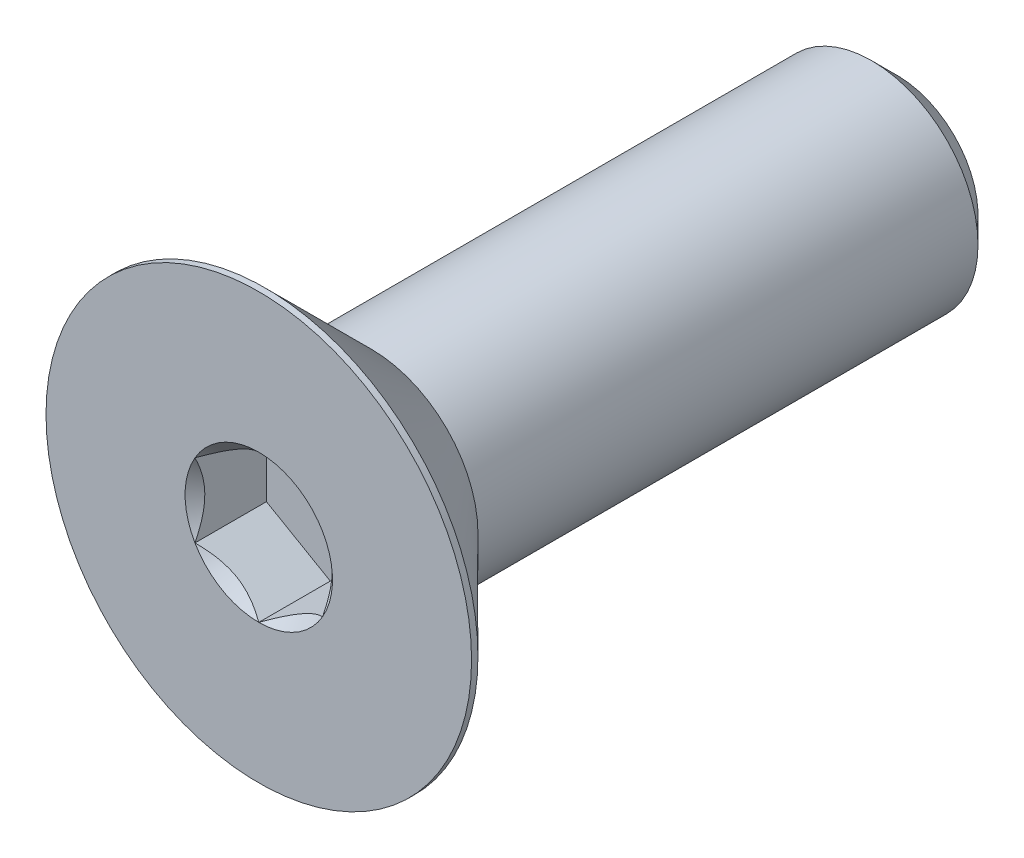
ISO-10303-21;
HEADER;
FILE_DESCRIPTION(('STEP AP214'),'2;1');
FILE_NAME('part.step','',(''),(''),'','','');
FILE_SCHEMA(('AUTOMOTIVE_DESIGN { 1 0 10303 214 1 1 1 1 }'));
ENDSEC;
DATA;
#1=APPLICATION_CONTEXT('core data for automotive mechanical design processes');
#2=APPLICATION_PROTOCOL_DEFINITION('international standard','automotive_design',2000,#1);
#3=PRODUCT_CONTEXT('',#1,'mechanical');
#4=PRODUCT('Part','Part','',(#3));
#5=PRODUCT_RELATED_PRODUCT_CATEGORY('part','',(#4));
#6=PRODUCT_DEFINITION_FORMATION('','',#4);
#7=PRODUCT_DEFINITION_CONTEXT('part definition',#1,'design');
#8=PRODUCT_DEFINITION('design','',#6,#7);
#9=PRODUCT_DEFINITION_SHAPE('','',#8);
#10=(LENGTH_UNIT() NAMED_UNIT(*) SI_UNIT(.MILLI.,.METRE.));
#11=(NAMED_UNIT(*) PLANE_ANGLE_UNIT() SI_UNIT($,.RADIAN.));
#12=(NAMED_UNIT(*) SI_UNIT($,.STERADIAN.) SOLID_ANGLE_UNIT());
#13=UNCERTAINTY_MEASURE_WITH_UNIT(LENGTH_MEASURE(1.E-05),#10,'distance_accuracy_value','');
#14=(GEOMETRIC_REPRESENTATION_CONTEXT(3) GLOBAL_UNCERTAINTY_ASSIGNED_CONTEXT((#13)) GLOBAL_UNIT_ASSIGNED_CONTEXT((#10,
#11,#12)) REPRESENTATION_CONTEXT('',''));
#15=CARTESIAN_POINT('',(0.,0.,0.));
#16=DIRECTION('',(0.,0.,1.));
#17=DIRECTION('',(1.,0.,0.));
#18=AXIS2_PLACEMENT_3D('',#15,#16,#17);
#19=CARTESIAN_POINT('',(-1.5,-0.866025403784439,7.22));
#20=DIRECTION('',(-0.5,-0.866025403784439,0.));
#21=DIRECTION('',(-0.866025403784439,0.5,0.));
#22=AXIS2_PLACEMENT_3D('',#19,#20,#21);
#23=PLANE('',#22);
#24=DIRECTION('',(0.,0.,1.));
#25=VECTOR('',#24,1.);
#26=CARTESIAN_POINT('',(-1.5,-0.866025403784439,7.22));
#27=LINE('',#26,#25);
#28=CARTESIAN_POINT('',(-1.5,-0.866025403784439,7.22));
#29=VERTEX_POINT('',#28);
#30=CARTESIAN_POINT('',(-1.5,-0.86602540378444,8.9));
#31=VERTEX_POINT('',#30);
#32=EDGE_CURVE('E11',#29,#31,#27,.T.);
#33=ORIENTED_EDGE('',*,*,#32,.T.);
#34=CARTESIAN_POINT('',(-1.5,-0.866025403784438,8.89999999999999));
#35=CARTESIAN_POINT('',(-0.750000000000001,-1.29903810567666,8.46698729810778));
#36=CARTESIAN_POINT('',(0.,-1.73205080756888,8.89999999999999));
#37=(BOUNDED_CURVE() B_SPLINE_CURVE(2,(#34,#35,#36),.UNSPECIFIED.,.F.,
.F.) B_SPLINE_CURVE_WITH_KNOTS((3,3),(-0.388312804292311,-0.130611113351457),
.UNSPECIFIED.) CURVE() GEOMETRIC_REPRESENTATION_ITEM() RATIONAL_B_SPLINE_CURVE((1.3094010767585,
1.51196612828742,1.3094010767585)) REPRESENTATION_ITEM(''));
#38=CARTESIAN_POINT('',(0.,-1.73205080756888,8.9));
#39=VERTEX_POINT('',#38);
#40=EDGE_CURVE('E133',#31,#39,#37,.T.);
#41=ORIENTED_EDGE('',*,*,#40,.T.);
#42=DIRECTION('',(0.,0.,1.));
#43=VECTOR('',#42,1.);
#44=CARTESIAN_POINT('',(0.,-1.73205080756888,7.22));
#45=LINE('',#44,#43);
#46=CARTESIAN_POINT('',(0.,-1.73205080756888,7.22));
#47=VERTEX_POINT('',#46);
#48=EDGE_CURVE('E206',#47,#39,#45,.T.);
#49=ORIENTED_EDGE('',*,*,#48,.F.);
#50=DIRECTION('',(0.866025403784439,-0.5,0.));
#51=VECTOR('',#50,1.);
#52=CARTESIAN_POINT('',(-1.5,-0.866025403784439,7.22));
#53=LINE('',#52,#51);
#54=EDGE_CURVE('E184',#29,#47,#53,.T.);
#55=ORIENTED_EDGE('',*,*,#54,.F.);
#56=EDGE_LOOP('',(#33,#41,#49,#55));
#57=FACE_BOUND('',#56,.T.);
#58=ADVANCED_FACE('F17',(#57),#23,.F.);
#59=CARTESIAN_POINT('',(-1.5,0.866025403784439,7.22));
#60=DIRECTION('',(-1.,0.,0.));
#61=DIRECTION('',(0.,1.,0.));
#62=AXIS2_PLACEMENT_3D('',#59,#60,#61);
#63=PLANE('',#62);
#64=DIRECTION('',(0.,0.,1.));
#65=VECTOR('',#64,1.);
#66=CARTESIAN_POINT('',(-1.5,0.866025403784439,7.22));
#67=LINE('',#66,#65);
#68=CARTESIAN_POINT('',(-1.5,0.866025403784439,7.22));
#69=VERTEX_POINT('',#68);
#70=CARTESIAN_POINT('',(-1.5,0.866025403784439,8.9));
#71=VERTEX_POINT('',#70);
#72=EDGE_CURVE('E26',#69,#71,#67,.T.);
#73=ORIENTED_EDGE('',*,*,#72,.T.);
#74=CARTESIAN_POINT('',(-1.5,0.866025403784444,8.89999999999999));
#75=CARTESIAN_POINT('',(-1.5,0.,8.46698729810778));
#76=CARTESIAN_POINT('',(-1.5,-0.86602540378444,8.89999999999999));
#77=(BOUNDED_CURVE() B_SPLINE_CURVE(2,(#74,#75,#76),.UNSPECIFIED.,.F.,
.F.) B_SPLINE_CURVE_WITH_KNOTS((3,3),(-0.388312804292312,-0.130611113351457),
.UNSPECIFIED.) CURVE() GEOMETRIC_REPRESENTATION_ITEM() RATIONAL_B_SPLINE_CURVE((1.3094010767585,
1.51196612828742,1.3094010767585)) REPRESENTATION_ITEM(''));
#78=EDGE_CURVE('E120',#71,#31,#77,.T.);
#79=ORIENTED_EDGE('',*,*,#78,.T.);
#80=ORIENTED_EDGE('',*,*,#32,.F.);
#81=DIRECTION('',(0.,-1.,0.));
#82=VECTOR('',#81,1.);
#83=CARTESIAN_POINT('',(-1.5,0.866025403784439,7.22));
#84=LINE('',#83,#82);
#85=EDGE_CURVE('E123',#69,#29,#84,.T.);
#86=ORIENTED_EDGE('',*,*,#85,.F.);
#87=EDGE_LOOP('',(#73,#79,#80,#86));
#88=FACE_BOUND('',#87,.T.);
#89=ADVANCED_FACE('F19',(#88),#63,.F.);
#90=CARTESIAN_POINT('',(0.,1.73205080756888,7.22));
#91=DIRECTION('',(-0.5,0.866025403784439,0.));
#92=DIRECTION('',(0.,0.,1.));
#93=AXIS2_PLACEMENT_3D('',#90,#91,#92);
#94=PLANE('',#93);
#95=DIRECTION('',(0.,0.,1.));
#96=VECTOR('',#95,1.);
#97=CARTESIAN_POINT('',(0.,1.73205080756888,7.22));
#98=LINE('',#97,#96);
#99=CARTESIAN_POINT('',(0.,1.73205080756888,7.22));
#100=VERTEX_POINT('',#99);
#101=CARTESIAN_POINT('',(0.,1.73205080756888,8.9));
#102=VERTEX_POINT('',#101);
#103=EDGE_CURVE('E47',#100,#102,#98,.T.);
#104=ORIENTED_EDGE('',*,*,#103,.T.);
#105=CARTESIAN_POINT('',(0.,1.73205080756888,8.89999999999999));
#106=CARTESIAN_POINT('',(-0.749999999999998,1.29903810567666,8.46698729810778));
#107=CARTESIAN_POINT('',(-1.5,0.86602540378444,8.89999999999999));
#108=(BOUNDED_CURVE() B_SPLINE_CURVE(2,(#105,#106,#107),.UNSPECIFIED.,.F.,
.F.) B_SPLINE_CURVE_WITH_KNOTS((3,3),(-0.388312804292311,-0.130611113351457),
.UNSPECIFIED.) CURVE() GEOMETRIC_REPRESENTATION_ITEM() RATIONAL_B_SPLINE_CURVE((1.3094010767585,
1.51196612828742,1.3094010767585)) REPRESENTATION_ITEM(''));
#109=EDGE_CURVE('E134',#102,#71,#108,.T.);
#110=ORIENTED_EDGE('',*,*,#109,.T.);
#111=ORIENTED_EDGE('',*,*,#72,.F.);
#112=DIRECTION('',(-0.866025403784439,-0.5,0.));
#113=VECTOR('',#112,1.);
#114=CARTESIAN_POINT('',(0.,1.73205080756888,7.22));
#115=LINE('',#114,#113);
#116=EDGE_CURVE('E203',#100,#69,#115,.T.);
#117=ORIENTED_EDGE('',*,*,#116,.F.);
#118=EDGE_LOOP('',(#104,#110,#111,#117));
#119=FACE_BOUND('',#118,.T.);
#120=ADVANCED_FACE('F138',(#119),#94,.F.);
#121=CARTESIAN_POINT('',(1.5,0.866025403784438,7.22));
#122=DIRECTION('',(0.5,0.866025403784439,0.));
#123=DIRECTION('',(0.,0.,-1.));
#124=AXIS2_PLACEMENT_3D('',#121,#122,#123);
#125=PLANE('',#124);
#126=DIRECTION('',(0.,0.,1.));
#127=VECTOR('',#126,1.);
#128=CARTESIAN_POINT('',(1.5,0.866025403784438,7.22));
#129=LINE('',#128,#127);
#130=CARTESIAN_POINT('',(1.5,0.866025403784438,7.22));
#131=VERTEX_POINT('',#130);
#132=CARTESIAN_POINT('',(1.5,0.866025403784438,8.9));
#133=VERTEX_POINT('',#132);
#134=EDGE_CURVE('E210',#131,#133,#129,.T.);
#135=ORIENTED_EDGE('',*,*,#134,.T.);
#136=CARTESIAN_POINT('',(1.5,0.866025403784438,8.89999999999999));
#137=CARTESIAN_POINT('',(0.750000000000001,1.29903810567666,8.46698729810778));
#138=CARTESIAN_POINT('',(0.,1.73205080756888,8.89999999999999));
#139=(BOUNDED_CURVE() B_SPLINE_CURVE(2,(#136,#137,#138),.UNSPECIFIED.,.F.,
.F.) B_SPLINE_CURVE_WITH_KNOTS((3,3),(-0.388312804292311,-0.130611113351457),
.UNSPECIFIED.) CURVE() GEOMETRIC_REPRESENTATION_ITEM() RATIONAL_B_SPLINE_CURVE((1.3094010767585,
1.51196612828742,1.3094010767585)) REPRESENTATION_ITEM(''));
#140=EDGE_CURVE('E141',#133,#102,#139,.T.);
#141=ORIENTED_EDGE('',*,*,#140,.T.);
#142=ORIENTED_EDGE('',*,*,#103,.F.);
#143=DIRECTION('',(-0.866025403784439,0.5,0.));
#144=VECTOR('',#143,1.);
#145=CARTESIAN_POINT('',(1.5,0.866025403784438,7.22));
#146=LINE('',#145,#144);
#147=EDGE_CURVE('E199',#131,#100,#146,.T.);
#148=ORIENTED_EDGE('',*,*,#147,.F.);
#149=EDGE_LOOP('',(#135,#141,#142,#148));
#150=FACE_BOUND('',#149,.T.);
#151=ADVANCED_FACE('F458',(#150),#125,.F.);
#152=CARTESIAN_POINT('',(1.5,-0.866025403784439,7.22));
#153=DIRECTION('',(1.,0.,0.));
#154=DIRECTION('',(0.,1.,0.));
#155=AXIS2_PLACEMENT_3D('',#152,#153,#154);
#156=PLANE('',#155);
#157=DIRECTION('',(0.,0.,1.));
#158=VECTOR('',#157,1.);
#159=CARTESIAN_POINT('',(1.5,-0.866025403784439,7.22));
#160=LINE('',#159,#158);
#161=CARTESIAN_POINT('',(1.5,-0.866025403784439,7.22));
#162=VERTEX_POINT('',#161);
#163=CARTESIAN_POINT('',(1.5,-0.866025403784439,8.9));
#164=VERTEX_POINT('',#163);
#165=EDGE_CURVE('E209',#162,#164,#160,.T.);
#166=ORIENTED_EDGE('',*,*,#165,.T.);
#167=CARTESIAN_POINT('',(1.5,-0.86602540378444,8.89999999999999));
#168=CARTESIAN_POINT('',(1.5,0.,8.46698729810778));
#169=CARTESIAN_POINT('',(1.5,0.866025403784437,8.89999999999999));
#170=(BOUNDED_CURVE() B_SPLINE_CURVE(2,(#167,#168,#169),.UNSPECIFIED.,.F.,
.F.) B_SPLINE_CURVE_WITH_KNOTS((3,3),(-0.388312804292311,-0.130611113351457),
.UNSPECIFIED.) CURVE() GEOMETRIC_REPRESENTATION_ITEM() RATIONAL_B_SPLINE_CURVE((1.3094010767585,
1.51196612828742,1.3094010767585)) REPRESENTATION_ITEM(''));
#171=EDGE_CURVE('E369',#164,#133,#170,.T.);
#172=ORIENTED_EDGE('',*,*,#171,.T.);
#173=ORIENTED_EDGE('',*,*,#134,.F.);
#174=DIRECTION('',(0.,1.,0.));
#175=VECTOR('',#174,1.);
#176=CARTESIAN_POINT('',(1.5,-0.866025403784439,7.22));
#177=LINE('',#176,#175);
#178=EDGE_CURVE('E195',#162,#131,#177,.T.);
#179=ORIENTED_EDGE('',*,*,#178,.F.);
#180=EDGE_LOOP('',(#166,#172,#173,#179));
#181=FACE_BOUND('',#180,.T.);
#182=ADVANCED_FACE('F455',(#181),#156,.F.);
#183=CARTESIAN_POINT('',(0.,-1.73205080756888,7.22));
#184=DIRECTION('',(0.5,-0.866025403784439,0.));
#185=DIRECTION('',(0.,0.,-1.));
#186=AXIS2_PLACEMENT_3D('',#183,#184,#185);
#187=PLANE('',#186);
#188=ORIENTED_EDGE('',*,*,#48,.T.);
#189=CARTESIAN_POINT('',(0.,-1.73205080756888,8.89999999999999));
#190=CARTESIAN_POINT('',(0.75,-1.29903810567666,8.46698729810778));
#191=CARTESIAN_POINT('',(1.5,-0.86602540378444,8.89999999999999));
#192=(BOUNDED_CURVE() B_SPLINE_CURVE(2,(#189,#190,#191),.UNSPECIFIED.,.F.,
.F.) B_SPLINE_CURVE_WITH_KNOTS((3,3),(-0.38831280429231,-0.130611113351457),
.UNSPECIFIED.) CURVE() GEOMETRIC_REPRESENTATION_ITEM() RATIONAL_B_SPLINE_CURVE((1.3094010767585,
1.51196612828741,1.3094010767585)) REPRESENTATION_ITEM(''));
#193=EDGE_CURVE('E150',#39,#164,#192,.T.);
#194=ORIENTED_EDGE('',*,*,#193,.T.);
#195=ORIENTED_EDGE('',*,*,#165,.F.);
#196=DIRECTION('',(0.866025403784439,0.5,0.));
#197=VECTOR('',#196,1.);
#198=CARTESIAN_POINT('',(0.,-1.73205080756888,7.22));
#199=LINE('',#198,#197);
#200=EDGE_CURVE('E191',#47,#162,#199,.T.);
#201=ORIENTED_EDGE('',*,*,#200,.F.);
#202=EDGE_LOOP('',(#188,#194,#195,#201));
#203=FACE_BOUND('',#202,.T.);
#204=ADVANCED_FACE('F453',(#203),#187,.F.);
#205=CARTESIAN_POINT('',(0.,-1.73205080756888,7.22));
#206=DIRECTION('',(0.,0.,1.));
#207=DIRECTION('',(1.,0.,0.));
#208=AXIS2_PLACEMENT_3D('',#205,#206,#207);
#209=PLANE('',#208);
#210=ORIENTED_EDGE('',*,*,#54,.T.);
#211=ORIENTED_EDGE('',*,*,#200,.T.);
#212=ORIENTED_EDGE('',*,*,#178,.T.);
#213=ORIENTED_EDGE('',*,*,#147,.T.);
#214=ORIENTED_EDGE('',*,*,#116,.T.);
#215=ORIENTED_EDGE('',*,*,#85,.T.);
#216=EDGE_LOOP('',(#210,#211,#212,#213,#214,#215));
#217=FACE_BOUND('',#216,.T.);
#218=ADVANCED_FACE('F450',(#217),#209,.T.);
#219=CARTESIAN_POINT('',(0.,0.,8.9));
#220=DIRECTION('',(0.,0.,1.));
#221=DIRECTION('',(1.,0.,0.));
#222=AXIS2_PLACEMENT_3D('',#219,#220,#221);
#223=CONICAL_SURFACE('',#222,1.73205080756888,0.78539816339745);
#224=CARTESIAN_POINT('',(0.,0.,8.9));
#225=DIRECTION('',(0.,0.,1.));
#226=DIRECTION('',(1.,0.,0.));
#227=AXIS2_PLACEMENT_3D('',#224,#225,#226);
#228=CIRCLE('',#227,1.73205080756888);
#229=EDGE_CURVE('E156',#31,#39,#228,.T.);
#230=ORIENTED_EDGE('',*,*,#229,.T.);
#231=ORIENTED_EDGE('',*,*,#40,.F.);
#232=EDGE_LOOP('',(#230,#231));
#233=FACE_BOUND('',#232,.T.);
#234=ADVANCED_FACE('F449',(#233),#223,.F.);
#235=CARTESIAN_POINT('',(0.,0.,8.9));
#236=DIRECTION('',(0.,0.,1.));
#237=DIRECTION('',(-1.,0.,0.));
#238=AXIS2_PLACEMENT_3D('',#235,#236,#237);
#239=CONICAL_SURFACE('',#238,1.73205080756888,0.78539816339745);
#240=CARTESIAN_POINT('',(0.,0.,8.9));
#241=DIRECTION('',(0.,0.,1.));
#242=DIRECTION('',(1.,0.,0.));
#243=AXIS2_PLACEMENT_3D('',#240,#241,#242);
#244=CIRCLE('',#243,1.73205080756888);
#245=EDGE_CURVE('E130',#71,#31,#244,.T.);
#246=ORIENTED_EDGE('',*,*,#245,.T.);
#247=ORIENTED_EDGE('',*,*,#78,.F.);
#248=EDGE_LOOP('',(#246,#247));
#249=FACE_BOUND('',#248,.T.);
#250=ADVANCED_FACE('F128',(#249),#239,.F.);
#251=CARTESIAN_POINT('',(0.,0.,8.9));
#252=DIRECTION('',(0.,0.,1.));
#253=DIRECTION('',(1.,0.,0.));
#254=AXIS2_PLACEMENT_3D('',#251,#252,#253);
#255=CONICAL_SURFACE('',#254,1.73205080756888,0.78539816339745);
#256=CARTESIAN_POINT('',(0.,0.,8.9));
#257=DIRECTION('',(0.,0.,1.));
#258=DIRECTION('',(1.,0.,0.));
#259=AXIS2_PLACEMENT_3D('',#256,#257,#258);
#260=CIRCLE('',#259,1.73205080756888);
#261=EDGE_CURVE('E144',#102,#71,#260,.T.);
#262=ORIENTED_EDGE('',*,*,#261,.T.);
#263=ORIENTED_EDGE('',*,*,#109,.F.);
#264=EDGE_LOOP('',(#262,#263));
#265=FACE_BOUND('',#264,.T.);
#266=ADVANCED_FACE('F145',(#265),#255,.F.);
#267=CARTESIAN_POINT('',(0.,0.,8.9));
#268=DIRECTION('',(0.,0.,1.));
#269=DIRECTION('',(1.,0.,0.));
#270=AXIS2_PLACEMENT_3D('',#267,#268,#269);
#271=CONICAL_SURFACE('',#270,1.73205080756888,0.78539816339745);
#272=CARTESIAN_POINT('',(0.,0.,8.9));
#273=DIRECTION('',(0.,0.,1.));
#274=DIRECTION('',(1.,0.,0.));
#275=AXIS2_PLACEMENT_3D('',#272,#273,#274);
#276=CIRCLE('',#275,1.73205080756888);
#277=EDGE_CURVE('E290',#133,#102,#276,.T.);
#278=ORIENTED_EDGE('',*,*,#277,.T.);
#279=ORIENTED_EDGE('',*,*,#140,.F.);
#280=EDGE_LOOP('',(#278,#279));
#281=FACE_BOUND('',#280,.T.);
#282=ADVANCED_FACE('F429',(#281),#271,.F.);
#283=CARTESIAN_POINT('',(0.,0.,8.9));
#284=DIRECTION('',(0.,0.,1.));
#285=DIRECTION('',(1.,0.,0.));
#286=AXIS2_PLACEMENT_3D('',#283,#284,#285);
#287=CONICAL_SURFACE('',#286,1.73205080756888,0.78539816339745);
#288=CARTESIAN_POINT('',(0.,0.,8.9));
#289=DIRECTION('',(0.,0.,1.));
#290=DIRECTION('',(1.,0.,0.));
#291=AXIS2_PLACEMENT_3D('',#288,#289,#290);
#292=CIRCLE('',#291,1.73205080756888);
#293=EDGE_CURVE('E163',#39,#164,#292,.T.);
#294=ORIENTED_EDGE('',*,*,#293,.T.);
#295=ORIENTED_EDGE('',*,*,#193,.F.);
#296=EDGE_LOOP('',(#294,#295));
#297=FACE_BOUND('',#296,.T.);
#298=ADVANCED_FACE('F400',(#297),#287,.F.);
#299=CARTESIAN_POINT('',(0.,1.9,-6.1));
#300=DIRECTION('',(0.,0.,-1.));
#301=DIRECTION('',(0.,-1.,0.));
#302=AXIS2_PLACEMENT_3D('',#299,#300,#301);
#303=PLANE('',#302);
#304=CARTESIAN_POINT('',(0.,0.,-6.1));
#305=DIRECTION('',(0.,0.,-1.));
#306=DIRECTION('',(-1.,0.,0.));
#307=AXIS2_PLACEMENT_3D('',#304,#305,#306);
#308=CIRCLE('',#307,1.9);
#309=CARTESIAN_POINT('',(-1.9,0.,-6.1));
#310=VERTEX_POINT('',#309);
#311=EDGE_CURVE('E345',#310,#310,#308,.T.);
#312=ORIENTED_EDGE('',*,*,#311,.T.);
#313=EDGE_LOOP('',(#312));
#314=FACE_BOUND('',#313,.T.);
#315=ADVANCED_FACE('F428',(#314),#303,.T.);
#316=CARTESIAN_POINT('',(0.,0.,8.9));
#317=DIRECTION('',(0.,0.,1.));
#318=DIRECTION('',(1.,0.,0.));
#319=AXIS2_PLACEMENT_3D('',#316,#317,#318);
#320=PLANE('',#319);
#321=ORIENTED_EDGE('',*,*,#277,.F.);
#322=CARTESIAN_POINT('',(0.,0.,8.9));
#323=DIRECTION('',(0.,0.,1.));
#324=DIRECTION('',(1.,0.,0.));
#325=AXIS2_PLACEMENT_3D('',#322,#323,#324);
#326=CIRCLE('',#325,1.73205080756888);
#327=EDGE_CURVE('E363',#164,#133,#326,.T.);
#328=ORIENTED_EDGE('',*,*,#327,.F.);
#329=ORIENTED_EDGE('',*,*,#293,.F.);
#330=ORIENTED_EDGE('',*,*,#229,.F.);
#331=ORIENTED_EDGE('',*,*,#245,.F.);
#332=ORIENTED_EDGE('',*,*,#261,.F.);
#333=EDGE_LOOP('',(#321,#328,#329,#330,#331,#332));
#334=FACE_BOUND('',#333,.T.);
#335=CARTESIAN_POINT('',(0.,0.,8.9));
#336=DIRECTION('',(0.,0.,-1.));
#337=DIRECTION('',(-1.,0.,0.));
#338=AXIS2_PLACEMENT_3D('',#335,#336,#337);
#339=CIRCLE('',#338,5.);
#340=CARTESIAN_POINT('',(5.,0.,8.9));
#341=VERTEX_POINT('',#340);
#342=EDGE_CURVE('E287',#341,#341,#339,.T.);
#343=ORIENTED_EDGE('',*,*,#342,.F.);
#344=EDGE_LOOP('',(#343));
#345=FACE_BOUND('',#344,.T.);
#346=ADVANCED_FACE('F152',(#334,#345),#320,.T.);
#347=CARTESIAN_POINT('',(0.,0.,-6.1));
#348=DIRECTION('',(0.,0.,-1.));
#349=DIRECTION('',(-1.,0.,0.));
#350=AXIS2_PLACEMENT_3D('',#347,#348,#349);
#351=CYLINDRICAL_SURFACE('',#350,5.);
#352=CARTESIAN_POINT('',(0.,0.,8.75));
#353=DIRECTION('',(0.,0.,-1.));
#354=DIRECTION('',(-1.,0.,0.));
#355=AXIS2_PLACEMENT_3D('',#352,#353,#354);
#356=CIRCLE('',#355,5.);
#357=CARTESIAN_POINT('',(5.,0.,8.75));
#358=VERTEX_POINT('',#357);
#359=CARTESIAN_POINT('',(-5.,0.,8.75));
#360=VERTEX_POINT('',#359);
#361=EDGE_CURVE('E312',#358,#360,#356,.T.);
#362=ORIENTED_EDGE('',*,*,#361,.F.);
#363=DIRECTION('',(0.,0.,1.));
#364=VECTOR('',#363,1.);
#365=CARTESIAN_POINT('',(5.,0.,-6.1));
#366=LINE('',#365,#364);
#367=EDGE_CURVE('E291',#358,#341,#366,.T.);
#368=ORIENTED_EDGE('',*,*,#367,.T.);
#369=ORIENTED_EDGE('',*,*,#342,.T.);
#370=ORIENTED_EDGE('',*,*,#367,.F.);
#371=CARTESIAN_POINT('',(0.,0.,8.75));
#372=DIRECTION('',(0.,0.,-1.));
#373=DIRECTION('',(-1.,0.,0.));
#374=AXIS2_PLACEMENT_3D('',#371,#372,#373);
#375=CIRCLE('',#374,5.);
#376=EDGE_CURVE('E297',#360,#358,#375,.T.);
#377=ORIENTED_EDGE('',*,*,#376,.F.);
#378=EDGE_LOOP('',(#362,#368,#369,#370,#377));
#379=FACE_BOUND('',#378,.T.);
#380=ADVANCED_FACE('F425',(#379),#351,.T.);
#381=CARTESIAN_POINT('',(0.,0.,6.25));
#382=DIRECTION('',(0.,0.,1.));
#383=DIRECTION('',(1.,0.,0.));
#384=AXIS2_PLACEMENT_3D('',#381,#382,#383);
#385=CONICAL_SURFACE('',#384,2.5,0.785398163397443);
#386=ORIENTED_EDGE('',*,*,#361,.T.);
#387=DIRECTION('',(0.707106781186544,0.,-0.707106781186551));
#388=VECTOR('',#387,1.);
#389=CARTESIAN_POINT('',(-2.5,0.,6.25));
#390=LINE('',#389,#388);
#391=CARTESIAN_POINT('',(-2.5,0.,6.25));
#392=VERTEX_POINT('',#391);
#393=EDGE_CURVE('E305',#360,#392,#390,.T.);
#394=ORIENTED_EDGE('',*,*,#393,.T.);
#395=CARTESIAN_POINT('',(0.,0.,6.25));
#396=DIRECTION('',(0.,0.,-1.));
#397=DIRECTION('',(-1.,0.,0.));
#398=AXIS2_PLACEMENT_3D('',#395,#396,#397);
#399=CIRCLE('',#398,2.5);
#400=CARTESIAN_POINT('',(2.5,0.,6.25));
#401=VERTEX_POINT('',#400);
#402=EDGE_CURVE('E324',#401,#392,#399,.T.);
#403=ORIENTED_EDGE('',*,*,#402,.F.);
#404=CARTESIAN_POINT('',(0.,0.,6.25));
#405=DIRECTION('',(0.,0.,-1.));
#406=DIRECTION('',(-1.,0.,0.));
#407=AXIS2_PLACEMENT_3D('',#404,#405,#406);
#408=CIRCLE('',#407,2.5);
#409=EDGE_CURVE('E318',#392,#401,#408,.T.);
#410=ORIENTED_EDGE('',*,*,#409,.F.);
#411=ORIENTED_EDGE('',*,*,#393,.F.);
#412=ORIENTED_EDGE('',*,*,#376,.T.);
#413=EDGE_LOOP('',(#386,#394,#403,#410,#411,#412));
#414=FACE_BOUND('',#413,.T.);
#415=ADVANCED_FACE('F423',(#414),#385,.T.);
#416=CARTESIAN_POINT('',(0.,0.,-6.1));
#417=DIRECTION('',(0.,0.,-1.));
#418=DIRECTION('',(-1.,0.,0.));
#419=AXIS2_PLACEMENT_3D('',#416,#417,#418);
#420=CYLINDRICAL_SURFACE('',#419,2.5);
#421=CARTESIAN_POINT('',(0.,0.,-5.5));
#422=DIRECTION('',(0.,0.,-1.));
#423=DIRECTION('',(-1.,0.,0.));
#424=AXIS2_PLACEMENT_3D('',#421,#422,#423);
#425=CIRCLE('',#424,2.5);
#426=CARTESIAN_POINT('',(2.5,0.,-5.5));
#427=VERTEX_POINT('',#426);
#428=CARTESIAN_POINT('',(-2.5,0.,-5.5));
#429=VERTEX_POINT('',#428);
#430=EDGE_CURVE('E357',#427,#429,#425,.T.);
#431=ORIENTED_EDGE('',*,*,#430,.F.);
#432=DIRECTION('',(0.,0.,1.));
#433=VECTOR('',#432,1.);
#434=CARTESIAN_POINT('',(2.5,0.,-6.1));
#435=LINE('',#434,#433);
#436=EDGE_CURVE('E330',#427,#401,#435,.T.);
#437=ORIENTED_EDGE('',*,*,#436,.T.);
#438=ORIENTED_EDGE('',*,*,#402,.T.);
#439=ORIENTED_EDGE('',*,*,#409,.T.);
#440=ORIENTED_EDGE('',*,*,#436,.F.);
#441=CARTESIAN_POINT('',(0.,0.,-5.5));
#442=DIRECTION('',(0.,0.,-1.));
#443=DIRECTION('',(-1.,0.,0.));
#444=AXIS2_PLACEMENT_3D('',#441,#442,#443);
#445=CIRCLE('',#444,2.5);
#446=EDGE_CURVE('E337',#429,#427,#445,.T.);
#447=ORIENTED_EDGE('',*,*,#446,.F.);
#448=EDGE_LOOP('',(#431,#437,#438,#439,#440,#447));
#449=FACE_BOUND('',#448,.T.);
#450=ADVANCED_FACE('F411',(#449),#420,.T.);
#451=CARTESIAN_POINT('',(0.,0.,-6.1));
#452=DIRECTION('',(0.,0.,1.));
#453=DIRECTION('',(1.,0.,0.));
#454=AXIS2_PLACEMENT_3D('',#451,#452,#453);
#455=CONICAL_SURFACE('',#454,1.9,0.785398163397453);
#456=ORIENTED_EDGE('',*,*,#430,.T.);
#457=DIRECTION('',(0.707106781186551,0.,-0.707106781186544));
#458=VECTOR('',#457,1.);
#459=CARTESIAN_POINT('',(-1.9,0.,-6.1));
#460=LINE('',#459,#458);
#461=EDGE_CURVE('E351',#429,#310,#460,.T.);
#462=ORIENTED_EDGE('',*,*,#461,.T.);
#463=ORIENTED_EDGE('',*,*,#311,.F.);
#464=ORIENTED_EDGE('',*,*,#461,.F.);
#465=ORIENTED_EDGE('',*,*,#446,.T.);
#466=EDGE_LOOP('',(#456,#462,#463,#464,#465));
#467=FACE_BOUND('',#466,.T.);
#468=ADVANCED_FACE('F404',(#467),#455,.T.);
#469=CARTESIAN_POINT('',(0.,0.,8.9));
#470=DIRECTION('',(0.,0.,1.));
#471=DIRECTION('',(1.,0.,0.));
#472=AXIS2_PLACEMENT_3D('',#469,#470,#471);
#473=CONICAL_SURFACE('',#472,1.73205080756888,0.78539816339745);
#474=ORIENTED_EDGE('',*,*,#171,.F.);
#475=ORIENTED_EDGE('',*,*,#327,.T.);
#476=EDGE_LOOP('',(#474,#475));
#477=FACE_BOUND('',#476,.T.);
#478=ADVANCED_FACE('F402',(#477),#473,.F.);
#479=CLOSED_SHELL('',(#58,#89,#120,#151,#182,#204,#218,#234,#250,#266,#282,#298,#315,#346,#380,
#415,#450,#468,#478));
#480=MANIFOLD_SOLID_BREP('B1',#479);
#481=ADVANCED_BREP_SHAPE_REPRESENTATION('',(#18,#480),#14);
#482=SHAPE_DEFINITION_REPRESENTATION(#9,#481);
ENDSEC;
END-ISO-10303-21;
